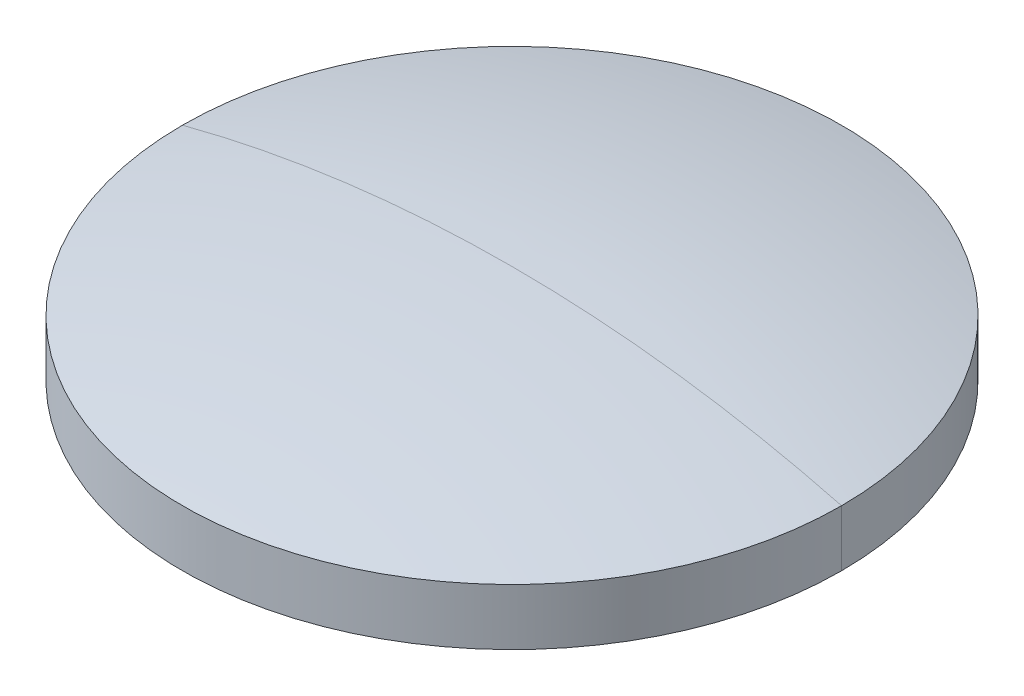
ISO-10303-21;
HEADER;
FILE_DESCRIPTION(('STEP AP214'),'2;1');
FILE_NAME('part.step','',(''),(''),'','','');
FILE_SCHEMA(('AUTOMOTIVE_DESIGN { 1 0 10303 214 1 1 1 1 }'));
ENDSEC;
DATA;
#1=APPLICATION_CONTEXT('core data for automotive mechanical design processes');
#2=APPLICATION_PROTOCOL_DEFINITION('international standard','automotive_design',2000,#1);
#3=PRODUCT_CONTEXT('',#1,'mechanical');
#4=PRODUCT('Part','Part','',(#3));
#5=PRODUCT_RELATED_PRODUCT_CATEGORY('part','',(#4));
#6=PRODUCT_DEFINITION_FORMATION('','',#4);
#7=PRODUCT_DEFINITION_CONTEXT('part definition',#1,'design');
#8=PRODUCT_DEFINITION('design','',#6,#7);
#9=PRODUCT_DEFINITION_SHAPE('','',#8);
#10=(LENGTH_UNIT() NAMED_UNIT(*) SI_UNIT(.MILLI.,.METRE.));
#11=(NAMED_UNIT(*) PLANE_ANGLE_UNIT() SI_UNIT($,.RADIAN.));
#12=(NAMED_UNIT(*) SI_UNIT($,.STERADIAN.) SOLID_ANGLE_UNIT());
#13=UNCERTAINTY_MEASURE_WITH_UNIT(LENGTH_MEASURE(1.E-05),#10,'distance_accuracy_value','');
#14=(GEOMETRIC_REPRESENTATION_CONTEXT(3) GLOBAL_UNCERTAINTY_ASSIGNED_CONTEXT((#13)) GLOBAL_UNIT_ASSIGNED_CONTEXT((#10,
#11,#12)) REPRESENTATION_CONTEXT('',''));
#15=CARTESIAN_POINT('',(0.,0.,0.));
#16=DIRECTION('',(0.,0.,1.));
#17=DIRECTION('',(1.,0.,0.));
#18=AXIS2_PLACEMENT_3D('',#15,#16,#17);
#19=CARTESIAN_POINT('',(0.,-15.92093402926,0.));
#20=DIRECTION('',(0.,1.,0.));
#21=DIRECTION('',(-1.,0.,0.));
#22=AXIS2_PLACEMENT_3D('',#19,#20,#21);
#23=SPHERICAL_SURFACE('',#22,15.);
#24=CARTESIAN_POINT('',(0.,-15.92093402926,0.));
#25=DIRECTION('',(0.,0.,1.));
#26=DIRECTION('',(0.,1.,0.));
#27=AXIS2_PLACEMENT_3D('',#24,#25,#26);
#28=CIRCLE('',#27,15.);
#29=CARTESIAN_POINT('',(0.,-0.9209340292602,0.));
#30=VERTEX_POINT('',#29);
#31=CARTESIAN_POINT('',(-3.8,-1.410248311487,0.));
#32=VERTEX_POINT('',#31);
#33=EDGE_CURVE('E29',#30,#32,#28,.T.);
#34=ORIENTED_EDGE('',*,*,#33,.T.);
#35=CARTESIAN_POINT('',(0.,-1.410248311487,0.));
#36=DIRECTION('',(0.,-1.,0.));
#37=DIRECTION('',(1.,0.,0.));
#38=AXIS2_PLACEMENT_3D('',#35,#36,#37);
#39=CIRCLE('',#38,3.8);
#40=CARTESIAN_POINT('',(3.8,-1.410248311487,0.));
#41=VERTEX_POINT('',#40);
#42=EDGE_CURVE('E75',#41,#32,#39,.T.);
#43=ORIENTED_EDGE('',*,*,#42,.F.);
#44=CARTESIAN_POINT('',(0.,-15.92093402926,0.));
#45=DIRECTION('',(0.,0.,-1.));
#46=DIRECTION('',(0.,1.,0.));
#47=AXIS2_PLACEMENT_3D('',#44,#45,#46);
#48=CIRCLE('',#47,15.);
#49=EDGE_CURVE('E11',#30,#41,#48,.T.);
#50=ORIENTED_EDGE('',*,*,#49,.F.);
#51=EDGE_LOOP('',(#34,#43,#50));
#52=FACE_BOUND('',#51,.T.);
#53=ADVANCED_FACE('F16',(#52),#23,.T.);
#54=CARTESIAN_POINT('',(0.,-15.92093402926,0.));
#55=DIRECTION('',(0.,1.,0.));
#56=DIRECTION('',(-1.,0.,0.));
#57=AXIS2_PLACEMENT_3D('',#54,#55,#56);
#58=SPHERICAL_SURFACE('',#57,15.);
#59=CARTESIAN_POINT('',(0.,-1.410248311487,0.));
#60=DIRECTION('',(0.,1.,0.));
#61=DIRECTION('',(1.,0.,0.));
#62=AXIS2_PLACEMENT_3D('',#59,#60,#61);
#63=CIRCLE('',#62,3.8);
#64=EDGE_CURVE('E114',#41,#32,#63,.T.);
#65=ORIENTED_EDGE('',*,*,#64,.T.);
#66=ORIENTED_EDGE('',*,*,#33,.F.);
#67=ORIENTED_EDGE('',*,*,#49,.T.);
#68=EDGE_LOOP('',(#65,#66,#67));
#69=FACE_BOUND('',#68,.T.);
#70=ADVANCED_FACE('F150',(#69),#58,.T.);
#71=CARTESIAN_POINT('',(0.,-2.152812785445,0.));
#72=DIRECTION('',(0.,1.,0.));
#73=DIRECTION('',(-1.,0.,0.));
#74=AXIS2_PLACEMENT_3D('',#71,#72,#73);
#75=CYLINDRICAL_SURFACE('',#74,3.8);
#76=CARTESIAN_POINT('',(0.,-2.060248311487,0.));
#77=DIRECTION('',(0.,1.,0.));
#78=DIRECTION('',(1.,0.,0.));
#79=AXIS2_PLACEMENT_3D('',#76,#77,#78);
#80=CIRCLE('',#79,3.8);
#81=CARTESIAN_POINT('',(3.8,-2.060248311487,0.));
#82=VERTEX_POINT('',#81);
#83=CARTESIAN_POINT('',(-3.8,-2.060248311487,0.));
#84=VERTEX_POINT('',#83);
#85=EDGE_CURVE('E126',#82,#84,#80,.T.);
#86=ORIENTED_EDGE('',*,*,#85,.T.);
#87=DIRECTION('',(0.,-1.,0.));
#88=VECTOR('',#87,1.);
#89=CARTESIAN_POINT('',(-3.8,-1.410248311487,0.));
#90=LINE('',#89,#88);
#91=EDGE_CURVE('E115',#32,#84,#90,.T.);
#92=ORIENTED_EDGE('',*,*,#91,.F.);
#93=ORIENTED_EDGE('',*,*,#64,.F.);
#94=DIRECTION('',(0.,-1.,0.));
#95=VECTOR('',#94,1.);
#96=CARTESIAN_POINT('',(3.8,-1.410248311487,0.));
#97=LINE('',#96,#95);
#98=EDGE_CURVE('E111',#41,#82,#97,.T.);
#99=ORIENTED_EDGE('',*,*,#98,.T.);
#100=EDGE_LOOP('',(#86,#92,#93,#99));
#101=FACE_BOUND('',#100,.T.);
#102=ADVANCED_FACE('F153',(#101),#75,.T.);
#103=CARTESIAN_POINT('',(0.,-2.152812785445,0.));
#104=DIRECTION('',(0.,1.,0.));
#105=DIRECTION('',(-1.,0.,0.));
#106=AXIS2_PLACEMENT_3D('',#103,#104,#105);
#107=CYLINDRICAL_SURFACE('',#106,3.8);
#108=ORIENTED_EDGE('',*,*,#42,.T.);
#109=ORIENTED_EDGE('',*,*,#91,.T.);
#110=CARTESIAN_POINT('',(0.,-2.060248311487,0.));
#111=DIRECTION('',(0.,-1.,0.));
#112=DIRECTION('',(1.,0.,0.));
#113=AXIS2_PLACEMENT_3D('',#110,#111,#112);
#114=CIRCLE('',#113,3.8);
#115=EDGE_CURVE('E110',#82,#84,#114,.T.);
#116=ORIENTED_EDGE('',*,*,#115,.F.);
#117=ORIENTED_EDGE('',*,*,#98,.F.);
#118=EDGE_LOOP('',(#108,#109,#116,#117));
#119=FACE_BOUND('',#118,.T.);
#120=ADVANCED_FACE('F149',(#119),#107,.T.);
#121=CARTESIAN_POINT('',(0.,-1.910363755039,0.));
#122=CARTESIAN_POINT('',(0.6784421092369,-1.910363755039,0.));
#123=CARTESIAN_POINT('',(1.30557128979488,-1.9386373268,0.));
#124=CARTESIAN_POINT('',(1.96308964982832,-1.8106330176771,0.));
#125=CARTESIAN_POINT('',(1.98489779738094,-1.7989588323229,0.));
#126=(BOUNDED_CURVE() B_SPLINE_CURVE(3,(#121,#122,#123,#124,#125),.UNSPECIFIED.,.F.,
.F.) B_SPLINE_CURVE_WITH_KNOTS((4,1,4),(0.,0.9537036306359,0.9900904944688),
.UNSPECIFIED.) CURVE() GEOMETRIC_REPRESENTATION_ITEM() RATIONAL_B_SPLINE_CURVE((1.,1.,1.,1.,1.)) REPRESENTATION_ITEM(''));
#127=CARTESIAN_POINT('',(0.,-2.152812785445,0.));
#128=DIRECTION('',(0.,-1.,0.));
#129=AXIS1_PLACEMENT('',#127,#128);
#130=SURFACE_OF_REVOLUTION('',#126,#129);
#131=CARTESIAN_POINT('',(0.,-1.798958832323,0.));
#132=DIRECTION('',(0.,-1.,0.));
#133=DIRECTION('',(1.,0.,0.));
#134=AXIS2_PLACEMENT_3D('',#131,#132,#133);
#135=CIRCLE('',#134,1.984897797381);
#136=CARTESIAN_POINT('',(1.984897797381,-1.798958832323,0.));
#137=VERTEX_POINT('',#136);
#138=CARTESIAN_POINT('',(-1.984897797381,-1.798958832323,0.));
#139=VERTEX_POINT('',#138);
#140=EDGE_CURVE('E71',#137,#139,#135,.T.);
#141=ORIENTED_EDGE('',*,*,#140,.T.);
#142=CARTESIAN_POINT('',(-1.984897797381,-1.798958832323,0.));
#143=CARTESIAN_POINT('',(-1.963089649828,-1.810633017677,0.));
#144=CARTESIAN_POINT('',(-1.305571289795,-1.9386373268,0.));
#145=CARTESIAN_POINT('',(-0.6784421092369,-1.910363755039,0.));
#146=CARTESIAN_POINT('',(0.,-1.910363755039,0.));
#147=(BOUNDED_CURVE() B_SPLINE_CURVE(3,(#142,#143,#144,#145,#146),.UNSPECIFIED.,.F.,
.F.) B_SPLINE_CURVE_WITH_KNOTS((4,1,4),(0.,0.03675104855182,1.),
.UNSPECIFIED.) CURVE() GEOMETRIC_REPRESENTATION_ITEM() RATIONAL_B_SPLINE_CURVE((1.,1.,1.,1.,1.)) REPRESENTATION_ITEM(''));
#148=CARTESIAN_POINT('',(0.,-1.910363755039,0.));
#149=VERTEX_POINT('',#148);
#150=EDGE_CURVE('E73',#139,#149,#147,.T.);
#151=ORIENTED_EDGE('',*,*,#150,.T.);
#152=CARTESIAN_POINT('',(1.984897797381,-1.798958832323,0.));
#153=CARTESIAN_POINT('',(1.963089649828,-1.810633017677,0.));
#154=CARTESIAN_POINT('',(1.305571289795,-1.9386373268,0.));
#155=CARTESIAN_POINT('',(0.6784421092369,-1.910363755039,0.));
#156=CARTESIAN_POINT('',(0.,-1.910363755039,0.));
#157=(BOUNDED_CURVE() B_SPLINE_CURVE(3,(#152,#153,#154,#155,#156),.UNSPECIFIED.,.F.,
.F.) B_SPLINE_CURVE_WITH_KNOTS((4,1,4),(0.,0.03675104855182,1.),
.UNSPECIFIED.) CURVE() GEOMETRIC_REPRESENTATION_ITEM() RATIONAL_B_SPLINE_CURVE((1.,1.,1.,1.,1.)) REPRESENTATION_ITEM(''));
#158=EDGE_CURVE('E61',#137,#149,#157,.T.);
#159=ORIENTED_EDGE('',*,*,#158,.F.);
#160=EDGE_LOOP('',(#141,#151,#159));
#161=FACE_BOUND('',#160,.T.);
#162=ADVANCED_FACE('F69',(#161),#130,.F.);
#163=CARTESIAN_POINT('',(0.,-1.910363755039,0.));
#164=CARTESIAN_POINT('',(0.6784421092369,-1.910363755039,0.));
#165=CARTESIAN_POINT('',(1.30557128979488,-1.9386373268,0.));
#166=CARTESIAN_POINT('',(1.96308964982832,-1.8106330176771,0.));
#167=CARTESIAN_POINT('',(1.98489779738094,-1.7989588323229,0.));
#168=(BOUNDED_CURVE() B_SPLINE_CURVE(3,(#163,#164,#165,#166,#167),.UNSPECIFIED.,.F.,
.F.) B_SPLINE_CURVE_WITH_KNOTS((4,1,4),(0.,0.9537036306359,0.9900904944688),
.UNSPECIFIED.) CURVE() GEOMETRIC_REPRESENTATION_ITEM() RATIONAL_B_SPLINE_CURVE((1.,1.,1.,1.,1.)) REPRESENTATION_ITEM(''));
#169=CARTESIAN_POINT('',(0.,-2.152812785445,0.));
#170=DIRECTION('',(0.,-1.,0.));
#171=AXIS1_PLACEMENT('',#169,#170);
#172=SURFACE_OF_REVOLUTION('',#168,#171);
#173=ORIENTED_EDGE('',*,*,#150,.F.);
#174=CARTESIAN_POINT('',(0.,-1.798958832323,0.));
#175=DIRECTION('',(0.,1.,0.));
#176=DIRECTION('',(1.,0.,0.));
#177=AXIS2_PLACEMENT_3D('',#174,#175,#176);
#178=CIRCLE('',#177,1.984897797381);
#179=EDGE_CURVE('E78',#137,#139,#178,.T.);
#180=ORIENTED_EDGE('',*,*,#179,.F.);
#181=ORIENTED_EDGE('',*,*,#158,.T.);
#182=EDGE_LOOP('',(#173,#180,#181));
#183=FACE_BOUND('',#182,.T.);
#184=ADVANCED_FACE('F18',(#183),#172,.F.);
#185=CARTESIAN_POINT('',(0.,-2.151609705702,0.));
#186=DIRECTION('',(0.,1.,0.));
#187=DIRECTION('',(-1.,0.,0.));
#188=AXIS2_PLACEMENT_3D('',#185,#186,#187);
#189=TOROIDAL_SURFACE('',#188,2.173676401849,0.4);
#190=ORIENTED_EDGE('',*,*,#179,.T.);
#191=CARTESIAN_POINT('',(-2.173676401849,-2.151609705702,0.));
#192=DIRECTION('',(0.,0.,-1.));
#193=DIRECTION('',(-0.190808995376495,0.981627183447674,0.));
#194=AXIS2_PLACEMENT_3D('',#191,#192,#193);
#195=CIRCLE('',#194,0.4);
#196=CARTESIAN_POINT('',(-2.25,-1.758958832323,0.));
#197=VERTEX_POINT('',#196);
#198=EDGE_CURVE('E97',#197,#139,#195,.T.);
#199=ORIENTED_EDGE('',*,*,#198,.F.);
#200=CARTESIAN_POINT('',(0.,-1.758958832323,0.));
#201=DIRECTION('',(0.,1.,0.));
#202=DIRECTION('',(1.,0.,0.));
#203=AXIS2_PLACEMENT_3D('',#200,#201,#202);
#204=CIRCLE('',#203,2.25);
#205=CARTESIAN_POINT('',(2.25,-1.758958832323,0.));
#206=VERTEX_POINT('',#205);
#207=EDGE_CURVE('E90',#206,#197,#204,.T.);
#208=ORIENTED_EDGE('',*,*,#207,.F.);
#209=CARTESIAN_POINT('',(2.173676401849,-2.151609705702,0.));
#210=DIRECTION('',(0.,0.,1.));
#211=DIRECTION('',(0.190808995376495,0.981627183447674,0.));
#212=AXIS2_PLACEMENT_3D('',#209,#210,#211);
#213=CIRCLE('',#212,0.4);
#214=EDGE_CURVE('E83',#206,#137,#213,.T.);
#215=ORIENTED_EDGE('',*,*,#214,.T.);
#216=EDGE_LOOP('',(#190,#199,#208,#215));
#217=FACE_BOUND('',#216,.T.);
#218=ADVANCED_FACE('F87',(#217),#189,.F.);
#219=CARTESIAN_POINT('',(0.,-2.151609705702,0.));
#220=DIRECTION('',(0.,1.,0.));
#221=DIRECTION('',(-1.,0.,0.));
#222=AXIS2_PLACEMENT_3D('',#219,#220,#221);
#223=TOROIDAL_SURFACE('',#222,2.173676401849,0.4);
#224=CARTESIAN_POINT('',(0.,-1.758958832323,0.));
#225=DIRECTION('',(0.,-1.,0.));
#226=DIRECTION('',(1.,0.,0.));
#227=AXIS2_PLACEMENT_3D('',#224,#225,#226);
#228=CIRCLE('',#227,2.25);
#229=EDGE_CURVE('E106',#206,#197,#228,.T.);
#230=ORIENTED_EDGE('',*,*,#229,.T.);
#231=ORIENTED_EDGE('',*,*,#198,.T.);
#232=ORIENTED_EDGE('',*,*,#140,.F.);
#233=ORIENTED_EDGE('',*,*,#214,.F.);
#234=EDGE_LOOP('',(#230,#231,#232,#233));
#235=FACE_BOUND('',#234,.T.);
#236=ADVANCED_FACE('F96',(#235),#223,.F.);
#237=CARTESIAN_POINT('',(0.,-1.909603571905,0.));
#238=DIRECTION('',(0.,-1.,0.));
#239=DIRECTION('',(1.,0.,0.));
#240=AXIS2_PLACEMENT_3D('',#237,#238,#239);
#241=CONICAL_SURFACE('',#240,3.025,1.37881010907526);
#242=ORIENTED_EDGE('',*,*,#115,.T.);
#243=DIRECTION('',(0.981627183447674,0.190808995376495,0.));
#244=VECTOR('',#243,1.);
#245=CARTESIAN_POINT('',(-3.8,-2.060248311487,0.));
#246=LINE('',#245,#244);
#247=EDGE_CURVE('E118',#84,#197,#246,.T.);
#248=ORIENTED_EDGE('',*,*,#247,.T.);
#249=ORIENTED_EDGE('',*,*,#229,.F.);
#250=DIRECTION('',(-0.981627183447674,0.190808995376495,0.));
#251=VECTOR('',#250,1.);
#252=CARTESIAN_POINT('',(3.8,-2.060248311487,0.));
#253=LINE('',#252,#251);
#254=EDGE_CURVE('E122',#82,#206,#253,.T.);
#255=ORIENTED_EDGE('',*,*,#254,.F.);
#256=EDGE_LOOP('',(#242,#248,#249,#255));
#257=FACE_BOUND('',#256,.T.);
#258=ADVANCED_FACE('F157',(#257),#241,.F.);
#259=CARTESIAN_POINT('',(0.,-1.909603571905,0.));
#260=DIRECTION('',(0.,-1.,0.));
#261=DIRECTION('',(1.,0.,0.));
#262=AXIS2_PLACEMENT_3D('',#259,#260,#261);
#263=CONICAL_SURFACE('',#262,3.025,1.37881010907526);
#264=ORIENTED_EDGE('',*,*,#207,.T.);
#265=ORIENTED_EDGE('',*,*,#247,.F.);
#266=ORIENTED_EDGE('',*,*,#85,.F.);
#267=ORIENTED_EDGE('',*,*,#254,.T.);
#268=EDGE_LOOP('',(#264,#265,#266,#267));
#269=FACE_BOUND('',#268,.T.);
#270=ADVANCED_FACE('F162',(#269),#263,.F.);
#271=CLOSED_SHELL('',(#53,#70,#102,#120,#162,#184,#218,#236,#258,#270));
#272=MANIFOLD_SOLID_BREP('B1',#271);
#273=ADVANCED_BREP_SHAPE_REPRESENTATION('',(#18,#272),#14);
#274=SHAPE_DEFINITION_REPRESENTATION(#9,#273);
ENDSEC;
END-ISO-10303-21;
